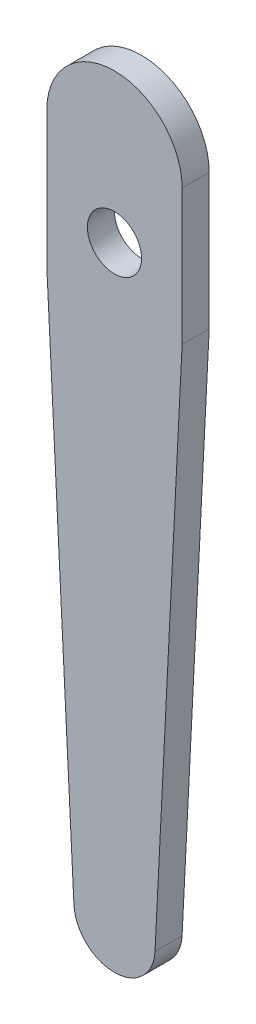
ISO-10303-21;
HEADER;
FILE_DESCRIPTION(('STEP AP214'),'2;1');
FILE_NAME('part.step','',(''),(''),'','','');
FILE_SCHEMA(('AUTOMOTIVE_DESIGN { 1 0 10303 214 1 1 1 1 }'));
ENDSEC;
DATA;
#1=APPLICATION_CONTEXT('core data for automotive mechanical design processes');
#2=APPLICATION_PROTOCOL_DEFINITION('international standard','automotive_design',2000,#1);
#3=PRODUCT_CONTEXT('',#1,'mechanical');
#4=PRODUCT('Part','Part','',(#3));
#5=PRODUCT_RELATED_PRODUCT_CATEGORY('part','',(#4));
#6=PRODUCT_DEFINITION_FORMATION('','',#4);
#7=PRODUCT_DEFINITION_CONTEXT('part definition',#1,'design');
#8=PRODUCT_DEFINITION('design','',#6,#7);
#9=PRODUCT_DEFINITION_SHAPE('','',#8);
#10=(LENGTH_UNIT() NAMED_UNIT(*) SI_UNIT(.MILLI.,.METRE.));
#11=(NAMED_UNIT(*) PLANE_ANGLE_UNIT() SI_UNIT($,.RADIAN.));
#12=(NAMED_UNIT(*) SI_UNIT($,.STERADIAN.) SOLID_ANGLE_UNIT());
#13=UNCERTAINTY_MEASURE_WITH_UNIT(LENGTH_MEASURE(1.E-05),#10,'distance_accuracy_value','');
#14=(GEOMETRIC_REPRESENTATION_CONTEXT(3) GLOBAL_UNCERTAINTY_ASSIGNED_CONTEXT((#13)) GLOBAL_UNIT_ASSIGNED_CONTEXT((#10,
#11,#12)) REPRESENTATION_CONTEXT('',''));
#15=CARTESIAN_POINT('',(0.,0.,0.));
#16=DIRECTION('',(0.,0.,1.));
#17=DIRECTION('',(1.,0.,0.));
#18=AXIS2_PLACEMENT_3D('',#15,#16,#17);
#19=CARTESIAN_POINT('',(6.60513718742189,-1887.46642025781,10.));
#20=DIRECTION('',(0.,0.,-1.));
#21=DIRECTION('',(-1.,0.,0.));
#22=AXIS2_PLACEMENT_3D('',#19,#20,#21);
#23=CYLINDRICAL_SURFACE('',#22,15.);
#24=CARTESIAN_POINT('',(6.60513718742189,-1887.46642025781,0.));
#25=DIRECTION('',(0.,0.,1.));
#26=DIRECTION('',(1.,0.,0.));
#27=AXIS2_PLACEMENT_3D('',#24,#25,#26);
#28=CIRCLE('',#27,15.);
#29=CARTESIAN_POINT('',(-8.37593486272664,-1888.2197330934,0.));
#30=VERTEX_POINT('',#29);
#31=CARTESIAN_POINT('',(21.5862092375704,-1888.2197330934,0.));
#32=VERTEX_POINT('',#31);
#33=EDGE_CURVE('E104',#30,#32,#28,.T.);
#34=ORIENTED_EDGE('',*,*,#33,.T.);
#35=DIRECTION('',(0.,0.,-1.));
#36=VECTOR('',#35,1.);
#37=CARTESIAN_POINT('',(21.5862092375704,-1888.2197330934,10.));
#38=LINE('',#37,#36);
#39=CARTESIAN_POINT('',(21.5862092375704,-1888.2197330934,10.));
#40=VERTEX_POINT('',#39);
#41=EDGE_CURVE('E11',#40,#32,#38,.T.);
#42=ORIENTED_EDGE('',*,*,#41,.F.);
#43=CARTESIAN_POINT('',(6.60513718742189,-1887.46642025781,10.));
#44=DIRECTION('',(0.,0.,1.));
#45=DIRECTION('',(1.,0.,0.));
#46=AXIS2_PLACEMENT_3D('',#43,#44,#45);
#47=CIRCLE('',#46,15.);
#48=CARTESIAN_POINT('',(-8.37593486272664,-1888.2197330934,10.));
#49=VERTEX_POINT('',#48);
#50=EDGE_CURVE('E82',#49,#40,#47,.T.);
#51=ORIENTED_EDGE('',*,*,#50,.F.);
#52=DIRECTION('',(0.,0.,-1.));
#53=VECTOR('',#52,1.);
#54=CARTESIAN_POINT('',(-8.37593486272664,-1888.2197330934,10.));
#55=LINE('',#54,#53);
#56=EDGE_CURVE('E114',#49,#30,#55,.T.);
#57=ORIENTED_EDGE('',*,*,#56,.T.);
#58=EDGE_LOOP('',(#34,#42,#51,#57));
#59=FACE_BOUND('',#58,.T.);
#60=ADVANCED_FACE('F35',(#59),#23,.T.);
#61=CARTESIAN_POINT('',(116.240116685453,-5.8450537862769,10.));
#62=DIRECTION('',(0.998738136676567,-0.0502208557057573,0.));
#63=DIRECTION('',(0.0502208557057573,0.998738136676567,0.));
#64=AXIS2_PLACEMENT_3D('',#61,#62,#63);
#65=PLANE('',#64);
#66=DIRECTION('',(-0.0502208557057573,-0.998738136676567,0.));
#67=VECTOR('',#66,1.);
#68=CARTESIAN_POINT('',(116.240116685453,-5.8450537862769,0.));
#69=LINE('',#68,#67);
#70=CARTESIAN_POINT('',(31.6051371874219,-1688.97411508247,0.));
#71=VERTEX_POINT('',#70);
#72=EDGE_CURVE('E122',#71,#32,#69,.T.);
#73=ORIENTED_EDGE('',*,*,#72,.F.);
#74=DIRECTION('',(0.,0.,-1.));
#75=VECTOR('',#74,1.);
#76=CARTESIAN_POINT('',(31.6051371874219,-1688.97411508247,10.));
#77=LINE('',#76,#75);
#78=CARTESIAN_POINT('',(31.6051371874219,-1688.97411508247,10.));
#79=VERTEX_POINT('',#78);
#80=EDGE_CURVE('E43',#79,#71,#77,.T.);
#81=ORIENTED_EDGE('',*,*,#80,.F.);
#82=DIRECTION('',(-0.0502208557057573,-0.998738136676567,0.));
#83=VECTOR('',#82,1.);
#84=CARTESIAN_POINT('',(116.240116685453,-5.8450537862769,10.));
#85=LINE('',#84,#83);
#86=EDGE_CURVE('E116',#79,#40,#85,.T.);
#87=ORIENTED_EDGE('',*,*,#86,.T.);
#88=ORIENTED_EDGE('',*,*,#41,.T.);
#89=EDGE_LOOP('',(#73,#81,#87,#88));
#90=FACE_BOUND('',#89,.T.);
#91=ADVANCED_FACE('F138',(#90),#65,.T.);
#92=CARTESIAN_POINT('',(31.6051371874221,0.,10.));
#93=DIRECTION('',(1.,0.,0.));
#94=DIRECTION('',(0.,1.,0.));
#95=AXIS2_PLACEMENT_3D('',#92,#93,#94);
#96=PLANE('',#95);
#97=DIRECTION('',(0.,-1.,0.));
#98=VECTOR('',#97,1.);
#99=CARTESIAN_POINT('',(31.6051371874221,0.,0.));
#100=LINE('',#99,#98);
#101=CARTESIAN_POINT('',(31.6051371874219,-1638.97411508247,0.));
#102=VERTEX_POINT('',#101);
#103=EDGE_CURVE('E125',#102,#71,#100,.T.);
#104=ORIENTED_EDGE('',*,*,#103,.F.);
#105=DIRECTION('',(0.,0.,-1.));
#106=VECTOR('',#105,1.);
#107=CARTESIAN_POINT('',(31.6051371874219,-1638.97411508247,10.));
#108=LINE('',#107,#106);
#109=CARTESIAN_POINT('',(31.6051371874219,-1638.97411508247,10.));
#110=VERTEX_POINT('',#109);
#111=EDGE_CURVE('E109',#110,#102,#108,.T.);
#112=ORIENTED_EDGE('',*,*,#111,.F.);
#113=DIRECTION('',(0.,-1.,0.));
#114=VECTOR('',#113,1.);
#115=CARTESIAN_POINT('',(31.6051371874221,0.,10.));
#116=LINE('',#115,#114);
#117=EDGE_CURVE('E100',#110,#79,#116,.T.);
#118=ORIENTED_EDGE('',*,*,#117,.T.);
#119=ORIENTED_EDGE('',*,*,#80,.T.);
#120=EDGE_LOOP('',(#104,#112,#118,#119));
#121=FACE_BOUND('',#120,.T.);
#122=ADVANCED_FACE('F135',(#121),#96,.T.);
#123=CARTESIAN_POINT('',(-18.3948628125781,0.,10.));
#124=DIRECTION('',(1.,0.,0.));
#125=DIRECTION('',(0.,0.,-1.));
#126=AXIS2_PLACEMENT_3D('',#123,#124,#125);
#127=PLANE('',#126);
#128=DIRECTION('',(0.,-1.,0.));
#129=VECTOR('',#128,1.);
#130=CARTESIAN_POINT('',(-18.3948628125781,0.,0.));
#131=LINE('',#130,#129);
#132=CARTESIAN_POINT('',(-18.3948628125781,-1638.97411508247,0.));
#133=VERTEX_POINT('',#132);
#134=CARTESIAN_POINT('',(-18.3948628125781,-1688.97411508247,0.));
#135=VERTEX_POINT('',#134);
#136=EDGE_CURVE('E71',#133,#135,#131,.T.);
#137=ORIENTED_EDGE('',*,*,#136,.T.);
#138=DIRECTION('',(0.,0.,-1.));
#139=VECTOR('',#138,1.);
#140=CARTESIAN_POINT('',(-18.3948628125781,-1688.97411508247,10.));
#141=LINE('',#140,#139);
#142=CARTESIAN_POINT('',(-18.3948628125781,-1688.97411508247,10.));
#143=VERTEX_POINT('',#142);
#144=EDGE_CURVE('E110',#143,#135,#141,.T.);
#145=ORIENTED_EDGE('',*,*,#144,.F.);
#146=DIRECTION('',(0.,-1.,0.));
#147=VECTOR('',#146,1.);
#148=CARTESIAN_POINT('',(-18.3948628125781,0.,10.));
#149=LINE('',#148,#147);
#150=CARTESIAN_POINT('',(-18.3948628125781,-1638.97411508247,10.));
#151=VERTEX_POINT('',#150);
#152=EDGE_CURVE('E98',#151,#143,#149,.T.);
#153=ORIENTED_EDGE('',*,*,#152,.F.);
#154=DIRECTION('',(0.,0.,-1.));
#155=VECTOR('',#154,1.);
#156=CARTESIAN_POINT('',(-18.3948628125781,-1638.97411508247,10.));
#157=LINE('',#156,#155);
#158=EDGE_CURVE('E107',#151,#133,#157,.T.);
#159=ORIENTED_EDGE('',*,*,#158,.T.);
#160=EDGE_LOOP('',(#137,#145,#153,#159));
#161=FACE_BOUND('',#160,.T.);
#162=ADVANCED_FACE('F112',(#161),#127,.F.);
#163=CARTESIAN_POINT('',(-103.063160397354,-5.18245966266834,10.));
#164=DIRECTION('',(0.998738136676567,0.0502208557057574,0.));
#165=DIRECTION('',(-0.0502208557057574,0.998738136676567,0.));
#166=AXIS2_PLACEMENT_3D('',#163,#164,#165);
#167=PLANE('',#166);
#168=DIRECTION('',(0.0502208557057574,-0.998738136676567,0.));
#169=VECTOR('',#168,1.);
#170=CARTESIAN_POINT('',(-103.063160397354,-5.18245966266834,0.));
#171=LINE('',#170,#169);
#172=EDGE_CURVE('E77',#135,#30,#171,.T.);
#173=ORIENTED_EDGE('',*,*,#172,.T.);
#174=ORIENTED_EDGE('',*,*,#56,.F.);
#175=DIRECTION('',(0.0502208557057574,-0.998738136676567,0.));
#176=VECTOR('',#175,1.);
#177=CARTESIAN_POINT('',(-103.063160397354,-5.18245966266834,10.));
#178=LINE('',#177,#176);
#179=EDGE_CURVE('E51',#143,#49,#178,.T.);
#180=ORIENTED_EDGE('',*,*,#179,.F.);
#181=ORIENTED_EDGE('',*,*,#144,.T.);
#182=EDGE_LOOP('',(#173,#174,#180,#181));
#183=FACE_BOUND('',#182,.T.);
#184=ADVANCED_FACE('F161',(#183),#167,.F.);
#185=CARTESIAN_POINT('',(0.,0.,10.));
#186=DIRECTION('',(0.,0.,1.));
#187=DIRECTION('',(1.,0.,0.));
#188=AXIS2_PLACEMENT_3D('',#185,#186,#187);
#189=PLANE('',#188);
#190=CARTESIAN_POINT('',(6.60513718742189,-1668.97411508247,10.));
#191=DIRECTION('',(0.,0.,-1.));
#192=DIRECTION('',(-1.,0.,0.));
#193=AXIS2_PLACEMENT_3D('',#190,#191,#192);
#194=CIRCLE('',#193,10.);
#195=CARTESIAN_POINT('',(-3.39486281257812,-1668.97411508247,10.));
#196=VERTEX_POINT('',#195);
#197=EDGE_CURVE('E142',#196,#196,#194,.T.);
#198=ORIENTED_EDGE('',*,*,#197,.T.);
#199=EDGE_LOOP('',(#198));
#200=FACE_BOUND('',#199,.T.);
#201=ORIENTED_EDGE('',*,*,#50,.T.);
#202=ORIENTED_EDGE('',*,*,#86,.F.);
#203=ORIENTED_EDGE('',*,*,#117,.F.);
#204=CARTESIAN_POINT('',(6.60513718742189,-1638.97411508247,10.));
#205=DIRECTION('',(0.,0.,1.));
#206=DIRECTION('',(1.,0.,0.));
#207=AXIS2_PLACEMENT_3D('',#204,#205,#206);
#208=CIRCLE('',#207,25.);
#209=EDGE_CURVE('E94',#110,#151,#208,.T.);
#210=ORIENTED_EDGE('',*,*,#209,.T.);
#211=ORIENTED_EDGE('',*,*,#152,.T.);
#212=ORIENTED_EDGE('',*,*,#179,.T.);
#213=EDGE_LOOP('',(#201,#202,#203,#210,#211,#212));
#214=FACE_BOUND('',#213,.T.);
#215=ADVANCED_FACE('F96',(#200,#214),#189,.T.);
#216=CARTESIAN_POINT('',(0.,0.,0.));
#217=DIRECTION('',(0.,0.,1.));
#218=DIRECTION('',(1.,0.,0.));
#219=AXIS2_PLACEMENT_3D('',#216,#217,#218);
#220=PLANE('',#219);
#221=CARTESIAN_POINT('',(6.60513718742189,-1668.97411508247,0.));
#222=DIRECTION('',(0.,0.,-1.));
#223=DIRECTION('',(-1.,0.,0.));
#224=AXIS2_PLACEMENT_3D('',#221,#222,#223);
#225=CIRCLE('',#224,10.);
#226=CARTESIAN_POINT('',(-3.39486281257812,-1668.97411508247,0.));
#227=VERTEX_POINT('',#226);
#228=EDGE_CURVE('E145',#227,#227,#225,.T.);
#229=ORIENTED_EDGE('',*,*,#228,.F.);
#230=EDGE_LOOP('',(#229));
#231=FACE_BOUND('',#230,.T.);
#232=ORIENTED_EDGE('',*,*,#33,.F.);
#233=ORIENTED_EDGE('',*,*,#172,.F.);
#234=ORIENTED_EDGE('',*,*,#136,.F.);
#235=CARTESIAN_POINT('',(6.60513718742189,-1638.97411508247,0.));
#236=DIRECTION('',(0.,0.,1.));
#237=DIRECTION('',(1.,0.,0.));
#238=AXIS2_PLACEMENT_3D('',#235,#236,#237);
#239=CIRCLE('',#238,25.);
#240=EDGE_CURVE('E105',#102,#133,#239,.T.);
#241=ORIENTED_EDGE('',*,*,#240,.F.);
#242=ORIENTED_EDGE('',*,*,#103,.T.);
#243=ORIENTED_EDGE('',*,*,#72,.T.);
#244=EDGE_LOOP('',(#232,#233,#234,#241,#242,#243));
#245=FACE_BOUND('',#244,.T.);
#246=ADVANCED_FACE('F141',(#231,#245),#220,.F.);
#247=CARTESIAN_POINT('',(6.60513718742189,-1638.97411508247,10.));
#248=DIRECTION('',(0.,0.,-1.));
#249=DIRECTION('',(-1.,0.,0.));
#250=AXIS2_PLACEMENT_3D('',#247,#248,#249);
#251=CYLINDRICAL_SURFACE('',#250,25.);
#252=ORIENTED_EDGE('',*,*,#240,.T.);
#253=ORIENTED_EDGE('',*,*,#158,.F.);
#254=ORIENTED_EDGE('',*,*,#209,.F.);
#255=ORIENTED_EDGE('',*,*,#111,.T.);
#256=EDGE_LOOP('',(#252,#253,#254,#255));
#257=FACE_BOUND('',#256,.T.);
#258=ADVANCED_FACE('F108',(#257),#251,.T.);
#259=CARTESIAN_POINT('',(6.60513718742189,-1668.97411508247,10.));
#260=DIRECTION('',(0.,0.,-1.));
#261=DIRECTION('',(-1.,0.,0.));
#262=AXIS2_PLACEMENT_3D('',#259,#260,#261);
#263=CYLINDRICAL_SURFACE('',#262,10.);
#264=ORIENTED_EDGE('',*,*,#197,.F.);
#265=EDGE_LOOP('',(#264));
#266=FACE_BOUND('',#265,.T.);
#267=ORIENTED_EDGE('',*,*,#228,.T.);
#268=EDGE_LOOP('',(#267));
#269=FACE_BOUND('',#268,.T.);
#270=ADVANCED_FACE('F152',(#266,#269),#263,.F.);
#271=CLOSED_SHELL('',(#60,#91,#122,#162,#184,#215,#246,#258,#270));
#272=MANIFOLD_SOLID_BREP('B2',#271);
#273=ADVANCED_BREP_SHAPE_REPRESENTATION('',(#18,#272),#14);
#274=SHAPE_DEFINITION_REPRESENTATION(#9,#273);
ENDSEC;
END-ISO-10303-21;
